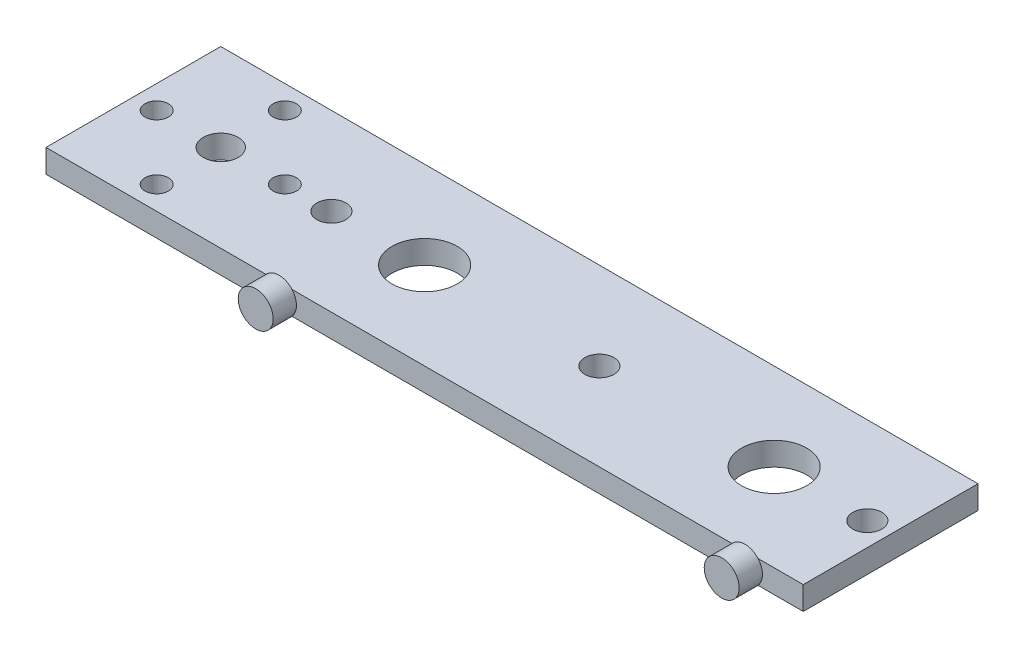
ISO-10303-21;
HEADER;
FILE_DESCRIPTION(('STEP AP214'),'2;1');
FILE_NAME('part.step','',(''),(''),'','','');
FILE_SCHEMA(('AUTOMOTIVE_DESIGN { 1 0 10303 214 1 1 1 1 }'));
ENDSEC;
DATA;
#1=APPLICATION_CONTEXT('core data for automotive mechanical design processes');
#2=APPLICATION_PROTOCOL_DEFINITION('international standard','automotive_design',2000,#1);
#3=PRODUCT_CONTEXT('',#1,'mechanical');
#4=PRODUCT('Part','Part','',(#3));
#5=PRODUCT_RELATED_PRODUCT_CATEGORY('part','',(#4));
#6=PRODUCT_DEFINITION_FORMATION('','',#4);
#7=PRODUCT_DEFINITION_CONTEXT('part definition',#1,'design');
#8=PRODUCT_DEFINITION('design','',#6,#7);
#9=PRODUCT_DEFINITION_SHAPE('','',#8);
#10=(LENGTH_UNIT() NAMED_UNIT(*) SI_UNIT(.MILLI.,.METRE.));
#11=(NAMED_UNIT(*) PLANE_ANGLE_UNIT() SI_UNIT($,.RADIAN.));
#12=(NAMED_UNIT(*) SI_UNIT($,.STERADIAN.) SOLID_ANGLE_UNIT());
#13=UNCERTAINTY_MEASURE_WITH_UNIT(LENGTH_MEASURE(1.E-05),#10,'distance_accuracy_value','');
#14=(GEOMETRIC_REPRESENTATION_CONTEXT(3) GLOBAL_UNCERTAINTY_ASSIGNED_CONTEXT((#13)) GLOBAL_UNIT_ASSIGNED_CONTEXT((#10,
#11,#12)) REPRESENTATION_CONTEXT('',''));
#15=CARTESIAN_POINT('',(0.,0.,0.));
#16=DIRECTION('',(0.,0.,1.));
#17=DIRECTION('',(1.,0.,0.));
#18=AXIS2_PLACEMENT_3D('',#15,#16,#17);
#19=CARTESIAN_POINT('',(0.,2.,7.5));
#20=DIRECTION('',(0.,0.,1.));
#21=DIRECTION('',(1.,0.,0.));
#22=AXIS2_PLACEMENT_3D('',#19,#20,#21);
#23=PLANE('',#22);
#24=CARTESIAN_POINT('',(20.,0.999999999999999,7.5));
#25=DIRECTION('',(0.,0.,1.));
#26=DIRECTION('',(1.,0.,0.));
#27=AXIS2_PLACEMENT_3D('',#24,#25,#26);
#28=CIRCLE('',#27,1.5);
#29=CARTESIAN_POINT('',(18.8819660112501,2.,7.5));
#30=VERTEX_POINT('',#29);
#31=CARTESIAN_POINT('',(18.8819660112501,0.,7.5));
#32=VERTEX_POINT('',#31);
#33=EDGE_CURVE('E12',#30,#32,#28,.T.);
#34=ORIENTED_EDGE('',*,*,#33,.F.);
#35=DIRECTION('',(-1.,0.,0.));
#36=VECTOR('',#35,1.);
#37=CARTESIAN_POINT('',(0.,2.,7.5));
#38=LINE('',#37,#36);
#39=CARTESIAN_POINT('',(-18.8819660112501,2.,7.5));
#40=VERTEX_POINT('',#39);
#41=EDGE_CURVE('E183',#30,#40,#38,.T.);
#42=ORIENTED_EDGE('',*,*,#41,.T.);
#43=CARTESIAN_POINT('',(-20.,0.999999999999995,7.5));
#44=DIRECTION('',(0.,0.,1.));
#45=DIRECTION('',(1.,0.,0.));
#46=AXIS2_PLACEMENT_3D('',#43,#44,#45);
#47=CIRCLE('',#46,1.5);
#48=CARTESIAN_POINT('',(-18.8819660112501,0.,7.5));
#49=VERTEX_POINT('',#48);
#50=EDGE_CURVE('E186',#49,#40,#47,.T.);
#51=ORIENTED_EDGE('',*,*,#50,.F.);
#52=DIRECTION('',(-1.,0.,0.));
#53=VECTOR('',#52,1.);
#54=CARTESIAN_POINT('',(0.,0.,7.5));
#55=LINE('',#54,#53);
#56=EDGE_CURVE('E597',#32,#49,#55,.T.);
#57=ORIENTED_EDGE('',*,*,#56,.F.);
#58=EDGE_LOOP('',(#34,#42,#51,#57));
#59=FACE_BOUND('',#58,.T.);
#60=ADVANCED_FACE('F119',(#59),#23,.T.);
#61=CARTESIAN_POINT('',(-21.1180339887499,2.,7.5));
#62=VERTEX_POINT('',#61);
#63=CARTESIAN_POINT('',(-21.1180339887499,0.,7.5));
#64=VERTEX_POINT('',#63);
#65=EDGE_CURVE('E138',#62,#64,#47,.T.);
#66=ORIENTED_EDGE('',*,*,#65,.F.);
#67=CARTESIAN_POINT('',(-40.,2.,7.5));
#68=VERTEX_POINT('',#67);
#69=EDGE_CURVE('E199',#62,#68,#38,.T.);
#70=ORIENTED_EDGE('',*,*,#69,.T.);
#71=DIRECTION('',(0.,-1.,0.));
#72=VECTOR('',#71,1.);
#73=CARTESIAN_POINT('',(-40.,2.,7.5));
#74=LINE('',#73,#72);
#75=CARTESIAN_POINT('',(-40.,0.,7.5));
#76=VERTEX_POINT('',#75);
#77=EDGE_CURVE('E211',#68,#76,#74,.T.);
#78=ORIENTED_EDGE('',*,*,#77,.T.);
#79=EDGE_CURVE('E322',#64,#76,#55,.T.);
#80=ORIENTED_EDGE('',*,*,#79,.F.);
#81=EDGE_LOOP('',(#66,#70,#78,#80));
#82=FACE_BOUND('',#81,.T.);
#83=ADVANCED_FACE('F394',(#82),#23,.T.);
#84=CARTESIAN_POINT('',(0.,0.,0.));
#85=DIRECTION('',(0.,1.,0.));
#86=DIRECTION('',(0.,0.,1.));
#87=AXIS2_PLACEMENT_3D('',#84,#85,#86);
#88=PLANE('',#87);
#89=CARTESIAN_POINT('',(-32.5,0.,-5.5));
#90=DIRECTION('',(0.,1.,0.));
#91=DIRECTION('',(0.,0.,1.));
#92=AXIS2_PLACEMENT_3D('',#89,#90,#91);
#93=CIRCLE('',#92,0.999999999999991);
#94=CARTESIAN_POINT('',(-32.5,0.,-4.50000000000001));
#95=VERTEX_POINT('',#94);
#96=EDGE_CURVE('E273',#95,#95,#93,.T.);
#97=ORIENTED_EDGE('',*,*,#96,.T.);
#98=EDGE_LOOP('',(#97));
#99=FACE_BOUND('',#98,.T.);
#100=CARTESIAN_POINT('',(-38.,0.,0.));
#101=DIRECTION('',(0.,1.,0.));
#102=DIRECTION('',(0.,0.,1.));
#103=AXIS2_PLACEMENT_3D('',#100,#101,#102);
#104=CIRCLE('',#103,0.999999999999991);
#105=CARTESIAN_POINT('',(-38.,0.,0.999999999999992));
#106=VERTEX_POINT('',#105);
#107=EDGE_CURVE('E239',#106,#106,#104,.T.);
#108=ORIENTED_EDGE('',*,*,#107,.T.);
#109=EDGE_LOOP('',(#108));
#110=FACE_BOUND('',#109,.T.);
#111=CARTESIAN_POINT('',(-32.5,0.,0.));
#112=DIRECTION('',(0.,1.,0.));
#113=DIRECTION('',(0.,0.,1.));
#114=AXIS2_PLACEMENT_3D('',#111,#112,#113);
#115=CIRCLE('',#114,1.5);
#116=CARTESIAN_POINT('',(-32.5,0.,1.50000000000001));
#117=VERTEX_POINT('',#116);
#118=EDGE_CURVE('E281',#117,#117,#115,.T.);
#119=ORIENTED_EDGE('',*,*,#118,.T.);
#120=EDGE_LOOP('',(#119));
#121=FACE_BOUND('',#120,.T.);
#122=CARTESIAN_POINT('',(-32.5,0.,5.5));
#123=DIRECTION('',(0.,1.,0.));
#124=DIRECTION('',(0.,0.,1.));
#125=AXIS2_PLACEMENT_3D('',#122,#123,#124);
#126=CIRCLE('',#125,0.999999999999998);
#127=CARTESIAN_POINT('',(-32.5,0.,6.5));
#128=VERTEX_POINT('',#127);
#129=EDGE_CURVE('E263',#128,#128,#126,.T.);
#130=ORIENTED_EDGE('',*,*,#129,.T.);
#131=EDGE_LOOP('',(#130));
#132=FACE_BOUND('',#131,.T.);
#133=CARTESIAN_POINT('',(-27.,0.,0.));
#134=DIRECTION('',(0.,1.,0.));
#135=DIRECTION('',(0.,0.,1.));
#136=AXIS2_PLACEMENT_3D('',#133,#134,#135);
#137=CIRCLE('',#136,0.999999999999998);
#138=CARTESIAN_POINT('',(-27.,0.,0.999999999999999));
#139=VERTEX_POINT('',#138);
#140=EDGE_CURVE('E264',#139,#139,#137,.T.);
#141=ORIENTED_EDGE('',*,*,#140,.T.);
#142=EDGE_LOOP('',(#141));
#143=FACE_BOUND('',#142,.T.);
#144=CARTESIAN_POINT('',(-15.,0.,0.));
#145=DIRECTION('',(0.,-1.,0.));
#146=DIRECTION('',(0.,0.,-1.));
#147=AXIS2_PLACEMENT_3D('',#144,#145,#146);
#148=CIRCLE('',#147,2.8);
#149=CARTESIAN_POINT('',(-15.,0.,-2.8));
#150=VERTEX_POINT('',#149);
#151=EDGE_CURVE('E229',#150,#150,#148,.T.);
#152=ORIENTED_EDGE('',*,*,#151,.F.);
#153=EDGE_LOOP('',(#152));
#154=FACE_BOUND('',#153,.T.);
#155=CARTESIAN_POINT('',(15.,0.,0.));
#156=DIRECTION('',(0.,1.,0.));
#157=DIRECTION('',(0.,0.,1.));
#158=AXIS2_PLACEMENT_3D('',#155,#156,#157);
#159=CIRCLE('',#158,2.80000000000001);
#160=CARTESIAN_POINT('',(15.,0.,2.80000000000001));
#161=VERTEX_POINT('',#160);
#162=EDGE_CURVE('E230',#161,#161,#159,.T.);
#163=ORIENTED_EDGE('',*,*,#162,.T.);
#164=EDGE_LOOP('',(#163));
#165=FACE_BOUND('',#164,.T.);
#166=CARTESIAN_POINT('',(0.,0.,0.));
#167=DIRECTION('',(0.,1.,0.));
#168=DIRECTION('',(0.,0.,1.));
#169=AXIS2_PLACEMENT_3D('',#166,#167,#168);
#170=CIRCLE('',#169,1.25);
#171=CARTESIAN_POINT('',(0.,0.,1.25));
#172=VERTEX_POINT('',#171);
#173=EDGE_CURVE('E252',#172,#172,#170,.T.);
#174=ORIENTED_EDGE('',*,*,#173,.T.);
#175=EDGE_LOOP('',(#174));
#176=FACE_BOUND('',#175,.T.);
#177=DIRECTION('',(0.,0.,-1.));
#178=VECTOR('',#177,1.);
#179=CARTESIAN_POINT('',(-40.,0.,0.));
#180=LINE('',#179,#178);
#181=CARTESIAN_POINT('',(-40.,0.,-7.5));
#182=VERTEX_POINT('',#181);
#183=EDGE_CURVE('E318',#76,#182,#180,.T.);
#184=ORIENTED_EDGE('',*,*,#183,.T.);
#185=DIRECTION('',(-1.,0.,0.));
#186=VECTOR('',#185,1.);
#187=CARTESIAN_POINT('',(0.,0.,-7.5));
#188=LINE('',#187,#186);
#189=CARTESIAN_POINT('',(25.,0.,-7.5));
#190=VERTEX_POINT('',#189);
#191=EDGE_CURVE('E310',#190,#182,#188,.T.);
#192=ORIENTED_EDGE('',*,*,#191,.F.);
#193=DIRECTION('',(0.,0.,1.));
#194=VECTOR('',#193,1.);
#195=CARTESIAN_POINT('',(25.,0.,-7.5));
#196=LINE('',#195,#194);
#197=CARTESIAN_POINT('',(25.,0.,7.5));
#198=VERTEX_POINT('',#197);
#199=EDGE_CURVE('E306',#190,#198,#196,.T.);
#200=ORIENTED_EDGE('',*,*,#199,.T.);
#201=CARTESIAN_POINT('',(21.1180339887499,0.,7.5));
#202=VERTEX_POINT('',#201);
#203=EDGE_CURVE('E323',#198,#202,#55,.T.);
#204=ORIENTED_EDGE('',*,*,#203,.T.);
#205=EDGE_CURVE('E327',#202,#32,#55,.T.);
#206=ORIENTED_EDGE('',*,*,#205,.T.);
#207=ORIENTED_EDGE('',*,*,#56,.T.);
#208=EDGE_CURVE('E599',#49,#64,#55,.T.);
#209=ORIENTED_EDGE('',*,*,#208,.T.);
#210=ORIENTED_EDGE('',*,*,#79,.T.);
#211=EDGE_LOOP('',(#184,#192,#200,#204,#206,#207,#209,#210));
#212=FACE_BOUND('',#211,.T.);
#213=CARTESIAN_POINT('',(23.,0.,0.));
#214=DIRECTION('',(0.,1.,0.));
#215=DIRECTION('',(0.,0.,1.));
#216=AXIS2_PLACEMENT_3D('',#213,#214,#215);
#217=CIRCLE('',#216,1.25);
#218=CARTESIAN_POINT('',(23.,0.,1.25));
#219=VERTEX_POINT('',#218);
#220=EDGE_CURVE('E248',#219,#219,#217,.T.);
#221=ORIENTED_EDGE('',*,*,#220,.T.);
#222=EDGE_LOOP('',(#221));
#223=FACE_BOUND('',#222,.T.);
#224=CARTESIAN_POINT('',(-23.,0.,0.));
#225=DIRECTION('',(0.,-1.,0.));
#226=DIRECTION('',(0.,0.,-1.));
#227=AXIS2_PLACEMENT_3D('',#224,#225,#226);
#228=CIRCLE('',#227,1.25);
#229=CARTESIAN_POINT('',(-23.,0.,-1.25));
#230=VERTEX_POINT('',#229);
#231=EDGE_CURVE('E247',#230,#230,#228,.T.);
#232=ORIENTED_EDGE('',*,*,#231,.F.);
#233=EDGE_LOOP('',(#232));
#234=FACE_BOUND('',#233,.T.);
#235=ADVANCED_FACE('F355',(#99,#110,#121,#132,#143,#154,#165,#176,#212,#223,#234),#88,.F.);
#236=CARTESIAN_POINT('',(0.,2.,0.));
#237=DIRECTION('',(0.,1.,0.));
#238=DIRECTION('',(0.,0.,1.));
#239=AXIS2_PLACEMENT_3D('',#236,#237,#238);
#240=PLANE('',#239);
#241=CARTESIAN_POINT('',(-32.5,2.,-5.5));
#242=DIRECTION('',(0.,1.,0.));
#243=DIRECTION('',(0.,0.,1.));
#244=AXIS2_PLACEMENT_3D('',#241,#242,#243);
#245=CIRCLE('',#244,0.999999999999991);
#246=CARTESIAN_POINT('',(-32.5,2.,-4.50000000000001));
#247=VERTEX_POINT('',#246);
#248=EDGE_CURVE('E291',#247,#247,#245,.T.);
#249=ORIENTED_EDGE('',*,*,#248,.F.);
#250=EDGE_LOOP('',(#249));
#251=FACE_BOUND('',#250,.T.);
#252=CARTESIAN_POINT('',(-38.,2.,0.));
#253=DIRECTION('',(0.,1.,0.));
#254=DIRECTION('',(0.,0.,1.));
#255=AXIS2_PLACEMENT_3D('',#252,#253,#254);
#256=CIRCLE('',#255,0.999999999999991);
#257=CARTESIAN_POINT('',(-38.,2.,0.999999999999992));
#258=VERTEX_POINT('',#257);
#259=EDGE_CURVE('E277',#258,#258,#256,.T.);
#260=ORIENTED_EDGE('',*,*,#259,.F.);
#261=EDGE_LOOP('',(#260));
#262=FACE_BOUND('',#261,.T.);
#263=CARTESIAN_POINT('',(-32.5,2.,0.));
#264=DIRECTION('',(0.,1.,0.));
#265=DIRECTION('',(0.,0.,1.));
#266=AXIS2_PLACEMENT_3D('',#263,#264,#265);
#267=CIRCLE('',#266,1.5);
#268=CARTESIAN_POINT('',(-32.5,2.,1.50000000000001));
#269=VERTEX_POINT('',#268);
#270=EDGE_CURVE('E268',#269,#269,#267,.T.);
#271=ORIENTED_EDGE('',*,*,#270,.F.);
#272=EDGE_LOOP('',(#271));
#273=FACE_BOUND('',#272,.T.);
#274=CARTESIAN_POINT('',(-32.5,2.,5.5));
#275=DIRECTION('',(0.,1.,0.));
#276=DIRECTION('',(0.,0.,1.));
#277=AXIS2_PLACEMENT_3D('',#274,#275,#276);
#278=CIRCLE('',#277,0.999999999999998);
#279=CARTESIAN_POINT('',(-32.5,2.,6.5));
#280=VERTEX_POINT('',#279);
#281=EDGE_CURVE('E259',#280,#280,#278,.T.);
#282=ORIENTED_EDGE('',*,*,#281,.F.);
#283=EDGE_LOOP('',(#282));
#284=FACE_BOUND('',#283,.T.);
#285=CARTESIAN_POINT('',(-27.,2.,0.));
#286=DIRECTION('',(0.,1.,0.));
#287=DIRECTION('',(0.,0.,1.));
#288=AXIS2_PLACEMENT_3D('',#285,#286,#287);
#289=CIRCLE('',#288,0.999999999999998);
#290=CARTESIAN_POINT('',(-27.,2.,0.999999999999999));
#291=VERTEX_POINT('',#290);
#292=EDGE_CURVE('E269',#291,#291,#289,.T.);
#293=ORIENTED_EDGE('',*,*,#292,.F.);
#294=EDGE_LOOP('',(#293));
#295=FACE_BOUND('',#294,.T.);
#296=CARTESIAN_POINT('',(23.,2.,0.));
#297=DIRECTION('',(0.,1.,0.));
#298=DIRECTION('',(0.,0.,1.));
#299=AXIS2_PLACEMENT_3D('',#296,#297,#298);
#300=CIRCLE('',#299,1.25);
#301=CARTESIAN_POINT('',(23.,2.,1.25));
#302=VERTEX_POINT('',#301);
#303=EDGE_CURVE('E234',#302,#302,#300,.T.);
#304=ORIENTED_EDGE('',*,*,#303,.F.);
#305=EDGE_LOOP('',(#304));
#306=FACE_BOUND('',#305,.T.);
#307=CARTESIAN_POINT('',(15.,2.,0.));
#308=DIRECTION('',(0.,1.,0.));
#309=DIRECTION('',(0.,0.,1.));
#310=AXIS2_PLACEMENT_3D('',#307,#308,#309);
#311=CIRCLE('',#310,2.80000000000001);
#312=CARTESIAN_POINT('',(15.,2.,2.80000000000001));
#313=VERTEX_POINT('',#312);
#314=EDGE_CURVE('E235',#313,#313,#311,.T.);
#315=ORIENTED_EDGE('',*,*,#314,.F.);
#316=EDGE_LOOP('',(#315));
#317=FACE_BOUND('',#316,.T.);
#318=CARTESIAN_POINT('',(0.,2.,0.));
#319=DIRECTION('',(0.,1.,0.));
#320=DIRECTION('',(0.,0.,1.));
#321=AXIS2_PLACEMENT_3D('',#318,#319,#320);
#322=CIRCLE('',#321,1.25);
#323=CARTESIAN_POINT('',(0.,2.,1.25));
#324=VERTEX_POINT('',#323);
#325=EDGE_CURVE('E302',#324,#324,#322,.T.);
#326=ORIENTED_EDGE('',*,*,#325,.F.);
#327=EDGE_LOOP('',(#326));
#328=FACE_BOUND('',#327,.T.);
#329=DIRECTION('',(0.,0.,-1.));
#330=VECTOR('',#329,1.);
#331=CARTESIAN_POINT('',(-40.,2.,0.));
#332=LINE('',#331,#330);
#333=CARTESIAN_POINT('',(-40.,2.,-7.5));
#334=VERTEX_POINT('',#333);
#335=EDGE_CURVE('E307',#68,#334,#332,.T.);
#336=ORIENTED_EDGE('',*,*,#335,.F.);
#337=ORIENTED_EDGE('',*,*,#69,.F.);
#338=EDGE_CURVE('E193',#40,#62,#38,.T.);
#339=ORIENTED_EDGE('',*,*,#338,.F.);
#340=ORIENTED_EDGE('',*,*,#41,.F.);
#341=CARTESIAN_POINT('',(21.1180339887499,2.,7.5));
#342=VERTEX_POINT('',#341);
#343=EDGE_CURVE('E192',#342,#30,#38,.T.);
#344=ORIENTED_EDGE('',*,*,#343,.F.);
#345=CARTESIAN_POINT('',(25.,2.,7.5));
#346=VERTEX_POINT('',#345);
#347=EDGE_CURVE('E311',#346,#342,#38,.T.);
#348=ORIENTED_EDGE('',*,*,#347,.F.);
#349=DIRECTION('',(0.,0.,1.));
#350=VECTOR('',#349,1.);
#351=CARTESIAN_POINT('',(25.,2.,-7.5));
#352=LINE('',#351,#350);
#353=CARTESIAN_POINT('',(25.,2.,-7.5));
#354=VERTEX_POINT('',#353);
#355=EDGE_CURVE('E336',#354,#346,#352,.T.);
#356=ORIENTED_EDGE('',*,*,#355,.F.);
#357=DIRECTION('',(-1.,0.,0.));
#358=VECTOR('',#357,1.);
#359=CARTESIAN_POINT('',(0.,2.,-7.5));
#360=LINE('',#359,#358);
#361=EDGE_CURVE('E314',#354,#334,#360,.T.);
#362=ORIENTED_EDGE('',*,*,#361,.T.);
#363=EDGE_LOOP('',(#336,#337,#339,#340,#344,#348,#356,#362));
#364=FACE_BOUND('',#363,.T.);
#365=CARTESIAN_POINT('',(-15.,2.,0.));
#366=DIRECTION('',(0.,1.,0.));
#367=DIRECTION('',(0.,0.,1.));
#368=AXIS2_PLACEMENT_3D('',#365,#366,#367);
#369=CIRCLE('',#368,2.8);
#370=CARTESIAN_POINT('',(-15.,2.,2.8));
#371=VERTEX_POINT('',#370);
#372=EDGE_CURVE('E225',#371,#371,#369,.F.);
#373=ORIENTED_EDGE('',*,*,#372,.T.);
#374=EDGE_LOOP('',(#373));
#375=FACE_BOUND('',#374,.T.);
#376=CARTESIAN_POINT('',(-23.,2.,0.));
#377=DIRECTION('',(0.,1.,0.));
#378=DIRECTION('',(0.,0.,1.));
#379=AXIS2_PLACEMENT_3D('',#376,#377,#378);
#380=CIRCLE('',#379,1.25);
#381=CARTESIAN_POINT('',(-23.,2.,1.25000000000001));
#382=VERTEX_POINT('',#381);
#383=EDGE_CURVE('E243',#382,#382,#380,.F.);
#384=ORIENTED_EDGE('',*,*,#383,.T.);
#385=EDGE_LOOP('',(#384));
#386=FACE_BOUND('',#385,.T.);
#387=ADVANCED_FACE('F197',(#251,#262,#273,#284,#295,#306,#317,#328,#364,#375,#386),#240,.T.);
#388=CARTESIAN_POINT('',(0.,2.,-7.5));
#389=DIRECTION('',(0.,0.,1.));
#390=DIRECTION('',(1.,0.,0.));
#391=AXIS2_PLACEMENT_3D('',#388,#389,#390);
#392=PLANE('',#391);
#393=ORIENTED_EDGE('',*,*,#191,.T.);
#394=DIRECTION('',(0.,-1.,0.));
#395=VECTOR('',#394,1.);
#396=CARTESIAN_POINT('',(-40.,2.,-7.5));
#397=LINE('',#396,#395);
#398=EDGE_CURVE('E317',#334,#182,#397,.T.);
#399=ORIENTED_EDGE('',*,*,#398,.F.);
#400=ORIENTED_EDGE('',*,*,#361,.F.);
#401=DIRECTION('',(0.,-1.,0.));
#402=VECTOR('',#401,1.);
#403=CARTESIAN_POINT('',(25.,2.,-7.5));
#404=LINE('',#403,#402);
#405=EDGE_CURVE('E340',#354,#190,#404,.T.);
#406=ORIENTED_EDGE('',*,*,#405,.T.);
#407=EDGE_LOOP('',(#393,#399,#400,#406));
#408=FACE_BOUND('',#407,.T.);
#409=ADVANCED_FACE('F361',(#408),#392,.F.);
#410=EDGE_CURVE('E129',#202,#342,#28,.T.);
#411=ORIENTED_EDGE('',*,*,#410,.F.);
#412=ORIENTED_EDGE('',*,*,#203,.F.);
#413=DIRECTION('',(0.,-1.,0.));
#414=VECTOR('',#413,1.);
#415=CARTESIAN_POINT('',(25.,2.,7.5));
#416=LINE('',#415,#414);
#417=EDGE_CURVE('E123',#346,#198,#416,.T.);
#418=ORIENTED_EDGE('',*,*,#417,.F.);
#419=ORIENTED_EDGE('',*,*,#347,.T.);
#420=EDGE_LOOP('',(#411,#412,#418,#419));
#421=FACE_BOUND('',#420,.T.);
#422=ADVANCED_FACE('F366',(#421),#23,.T.);
#423=CARTESIAN_POINT('',(-40.,2.,0.));
#424=DIRECTION('',(-1.,0.,0.));
#425=DIRECTION('',(0.,0.,1.));
#426=AXIS2_PLACEMENT_3D('',#423,#424,#425);
#427=PLANE('',#426);
#428=ORIENTED_EDGE('',*,*,#183,.F.);
#429=ORIENTED_EDGE('',*,*,#77,.F.);
#430=ORIENTED_EDGE('',*,*,#335,.T.);
#431=ORIENTED_EDGE('',*,*,#398,.T.);
#432=EDGE_LOOP('',(#428,#429,#430,#431));
#433=FACE_BOUND('',#432,.T.);
#434=ADVANCED_FACE('F364',(#433),#427,.T.);
#435=CARTESIAN_POINT('',(25.,2.,-7.5));
#436=DIRECTION('',(1.,0.,0.));
#437=DIRECTION('',(0.,0.,-1.));
#438=AXIS2_PLACEMENT_3D('',#435,#436,#437);
#439=PLANE('',#438);
#440=ORIENTED_EDGE('',*,*,#199,.F.);
#441=ORIENTED_EDGE('',*,*,#405,.F.);
#442=ORIENTED_EDGE('',*,*,#355,.T.);
#443=ORIENTED_EDGE('',*,*,#417,.T.);
#444=EDGE_LOOP('',(#440,#441,#442,#443));
#445=FACE_BOUND('',#444,.T.);
#446=ADVANCED_FACE('F121',(#445),#439,.T.);
#447=CARTESIAN_POINT('',(0.,9.91959594928935,0.));
#448=DIRECTION('',(0.,-1.,0.));
#449=DIRECTION('',(0.,0.,-1.));
#450=AXIS2_PLACEMENT_3D('',#447,#448,#449);
#451=CYLINDRICAL_SURFACE('',#450,1.25);
#452=ORIENTED_EDGE('',*,*,#173,.F.);
#453=EDGE_LOOP('',(#452));
#454=FACE_BOUND('',#453,.T.);
#455=ORIENTED_EDGE('',*,*,#325,.T.);
#456=EDGE_LOOP('',(#455));
#457=FACE_BOUND('',#456,.T.);
#458=ADVANCED_FACE('F407',(#454,#457),#451,.F.);
#459=CARTESIAN_POINT('',(15.,9.91959594928935,0.));
#460=DIRECTION('',(0.,-1.,0.));
#461=DIRECTION('',(0.,0.,-1.));
#462=AXIS2_PLACEMENT_3D('',#459,#460,#461);
#463=CYLINDRICAL_SURFACE('',#462,2.80000000000001);
#464=ORIENTED_EDGE('',*,*,#162,.F.);
#465=EDGE_LOOP('',(#464));
#466=FACE_BOUND('',#465,.T.);
#467=ORIENTED_EDGE('',*,*,#314,.T.);
#468=EDGE_LOOP('',(#467));
#469=FACE_BOUND('',#468,.T.);
#470=ADVANCED_FACE('F413',(#466,#469),#463,.F.);
#471=CARTESIAN_POINT('',(-15.,9.91959594928935,0.));
#472=DIRECTION('',(0.,-1.,0.));
#473=DIRECTION('',(0.,0.,-1.));
#474=AXIS2_PLACEMENT_3D('',#471,#472,#473);
#475=CYLINDRICAL_SURFACE('',#474,2.8);
#476=ORIENTED_EDGE('',*,*,#151,.T.);
#477=EDGE_LOOP('',(#476));
#478=FACE_BOUND('',#477,.T.);
#479=ORIENTED_EDGE('',*,*,#372,.F.);
#480=EDGE_LOOP('',(#479));
#481=FACE_BOUND('',#480,.T.);
#482=ADVANCED_FACE('F419',(#478,#481),#475,.F.);
#483=CARTESIAN_POINT('',(23.,9.91959594928935,0.));
#484=DIRECTION('',(0.,-1.,0.));
#485=DIRECTION('',(0.,0.,-1.));
#486=AXIS2_PLACEMENT_3D('',#483,#484,#485);
#487=CYLINDRICAL_SURFACE('',#486,1.25);
#488=ORIENTED_EDGE('',*,*,#220,.F.);
#489=EDGE_LOOP('',(#488));
#490=FACE_BOUND('',#489,.T.);
#491=ORIENTED_EDGE('',*,*,#303,.T.);
#492=EDGE_LOOP('',(#491));
#493=FACE_BOUND('',#492,.T.);
#494=ADVANCED_FACE('F456',(#490,#493),#487,.F.);
#495=CARTESIAN_POINT('',(-23.,9.91959594928935,0.));
#496=DIRECTION('',(0.,-1.,0.));
#497=DIRECTION('',(0.,0.,-1.));
#498=AXIS2_PLACEMENT_3D('',#495,#496,#497);
#499=CYLINDRICAL_SURFACE('',#498,1.25);
#500=ORIENTED_EDGE('',*,*,#231,.T.);
#501=EDGE_LOOP('',(#500));
#502=FACE_BOUND('',#501,.T.);
#503=ORIENTED_EDGE('',*,*,#383,.F.);
#504=EDGE_LOOP('',(#503));
#505=FACE_BOUND('',#504,.T.);
#506=ADVANCED_FACE('F462',(#502,#505),#499,.F.);
#507=CARTESIAN_POINT('',(-27.,9.91959594928935,0.));
#508=DIRECTION('',(0.,-1.,0.));
#509=DIRECTION('',(0.,0.,-1.));
#510=AXIS2_PLACEMENT_3D('',#507,#508,#509);
#511=CYLINDRICAL_SURFACE('',#510,0.999999999999998);
#512=ORIENTED_EDGE('',*,*,#140,.F.);
#513=EDGE_LOOP('',(#512));
#514=FACE_BOUND('',#513,.T.);
#515=ORIENTED_EDGE('',*,*,#292,.T.);
#516=EDGE_LOOP('',(#515));
#517=FACE_BOUND('',#516,.T.);
#518=ADVANCED_FACE('F464',(#514,#517),#511,.F.);
#519=CARTESIAN_POINT('',(-32.5,9.91959594928935,5.5));
#520=DIRECTION('',(0.,-1.,0.));
#521=DIRECTION('',(0.,0.,-1.));
#522=AXIS2_PLACEMENT_3D('',#519,#520,#521);
#523=CYLINDRICAL_SURFACE('',#522,0.999999999999998);
#524=ORIENTED_EDGE('',*,*,#129,.F.);
#525=EDGE_LOOP('',(#524));
#526=FACE_BOUND('',#525,.T.);
#527=ORIENTED_EDGE('',*,*,#281,.T.);
#528=EDGE_LOOP('',(#527));
#529=FACE_BOUND('',#528,.T.);
#530=ADVANCED_FACE('F471',(#526,#529),#523,.F.);
#531=CARTESIAN_POINT('',(-32.5,9.91959594928935,0.));
#532=DIRECTION('',(0.,-1.,0.));
#533=DIRECTION('',(0.,0.,-1.));
#534=AXIS2_PLACEMENT_3D('',#531,#532,#533);
#535=CYLINDRICAL_SURFACE('',#534,1.5);
#536=ORIENTED_EDGE('',*,*,#118,.F.);
#537=EDGE_LOOP('',(#536));
#538=FACE_BOUND('',#537,.T.);
#539=ORIENTED_EDGE('',*,*,#270,.T.);
#540=EDGE_LOOP('',(#539));
#541=FACE_BOUND('',#540,.T.);
#542=ADVANCED_FACE('F478',(#538,#541),#535,.F.);
#543=CARTESIAN_POINT('',(-38.,9.91959594928935,0.));
#544=DIRECTION('',(0.,-1.,0.));
#545=DIRECTION('',(0.,0.,-1.));
#546=AXIS2_PLACEMENT_3D('',#543,#544,#545);
#547=CYLINDRICAL_SURFACE('',#546,0.999999999999991);
#548=ORIENTED_EDGE('',*,*,#107,.F.);
#549=EDGE_LOOP('',(#548));
#550=FACE_BOUND('',#549,.T.);
#551=ORIENTED_EDGE('',*,*,#259,.T.);
#552=EDGE_LOOP('',(#551));
#553=FACE_BOUND('',#552,.T.);
#554=ADVANCED_FACE('F481',(#550,#553),#547,.F.);
#555=CARTESIAN_POINT('',(-32.5,9.91959594928935,-5.5));
#556=DIRECTION('',(0.,-1.,0.));
#557=DIRECTION('',(0.,0.,-1.));
#558=AXIS2_PLACEMENT_3D('',#555,#556,#557);
#559=CYLINDRICAL_SURFACE('',#558,0.999999999999991);
#560=ORIENTED_EDGE('',*,*,#96,.F.);
#561=EDGE_LOOP('',(#560));
#562=FACE_BOUND('',#561,.T.);
#563=ORIENTED_EDGE('',*,*,#248,.T.);
#564=EDGE_LOOP('',(#563));
#565=FACE_BOUND('',#564,.T.);
#566=ADVANCED_FACE('F426',(#562,#565),#559,.F.);
#567=CARTESIAN_POINT('',(-20.,0.999999999999995,7.5));
#568=DIRECTION('',(0.,0.,1.));
#569=DIRECTION('',(1.,0.,0.));
#570=AXIS2_PLACEMENT_3D('',#567,#568,#569);
#571=PLANE('',#570);
#572=EDGE_CURVE('E207',#40,#62,#47,.T.);
#573=ORIENTED_EDGE('',*,*,#572,.F.);
#574=ORIENTED_EDGE('',*,*,#338,.T.);
#575=EDGE_LOOP('',(#573,#574));
#576=FACE_BOUND('',#575,.T.);
#577=ADVANCED_FACE('F213',(#576),#571,.F.);
#578=CARTESIAN_POINT('',(-20.,0.999999999999995,9.5));
#579=DIRECTION('',(0.,0.,-1.));
#580=DIRECTION('',(-1.,0.,0.));
#581=AXIS2_PLACEMENT_3D('',#578,#579,#580);
#582=CYLINDRICAL_SURFACE('',#581,1.5);
#583=CARTESIAN_POINT('',(-20.,0.999999999999995,9.5));
#584=DIRECTION('',(0.,0.,1.));
#585=DIRECTION('',(1.,0.,0.));
#586=AXIS2_PLACEMENT_3D('',#583,#584,#585);
#587=CIRCLE('',#586,1.5);
#588=CARTESIAN_POINT('',(-18.5,0.999999999999995,9.5));
#589=VERTEX_POINT('',#588);
#590=EDGE_CURVE('E219',#589,#589,#587,.T.);
#591=ORIENTED_EDGE('',*,*,#590,.F.);
#592=EDGE_LOOP('',(#591));
#593=FACE_BOUND('',#592,.T.);
#594=ORIENTED_EDGE('',*,*,#572,.T.);
#595=ORIENTED_EDGE('',*,*,#65,.T.);
#596=EDGE_CURVE('E209',#64,#49,#47,.T.);
#597=ORIENTED_EDGE('',*,*,#596,.T.);
#598=ORIENTED_EDGE('',*,*,#50,.T.);
#599=EDGE_LOOP('',(#594,#595,#597,#598));
#600=FACE_BOUND('',#599,.T.);
#601=ADVANCED_FACE('F206',(#593,#600),#582,.T.);
#602=CARTESIAN_POINT('',(-20.,0.999999999999995,9.5));
#603=DIRECTION('',(0.,0.,1.));
#604=DIRECTION('',(1.,0.,0.));
#605=AXIS2_PLACEMENT_3D('',#602,#603,#604);
#606=PLANE('',#605);
#607=ORIENTED_EDGE('',*,*,#590,.T.);
#608=EDGE_LOOP('',(#607));
#609=FACE_BOUND('',#608,.T.);
#610=ADVANCED_FACE('F551',(#609),#606,.T.);
#611=ORIENTED_EDGE('',*,*,#208,.F.);
#612=ORIENTED_EDGE('',*,*,#596,.F.);
#613=EDGE_LOOP('',(#611,#612));
#614=FACE_BOUND('',#613,.T.);
#615=ADVANCED_FACE('F389',(#614),#571,.F.);
#616=CARTESIAN_POINT('',(20.,0.999999999999999,7.5));
#617=DIRECTION('',(0.,0.,1.));
#618=DIRECTION('',(1.,0.,0.));
#619=AXIS2_PLACEMENT_3D('',#616,#617,#618);
#620=PLANE('',#619);
#621=EDGE_CURVE('E218',#342,#30,#28,.T.);
#622=ORIENTED_EDGE('',*,*,#621,.F.);
#623=ORIENTED_EDGE('',*,*,#343,.T.);
#624=EDGE_LOOP('',(#622,#623));
#625=FACE_BOUND('',#624,.T.);
#626=ADVANCED_FACE('F381',(#625),#620,.F.);
#627=CARTESIAN_POINT('',(20.,0.999999999999999,9.5));
#628=DIRECTION('',(0.,0.,-1.));
#629=DIRECTION('',(-1.,0.,0.));
#630=AXIS2_PLACEMENT_3D('',#627,#628,#629);
#631=CYLINDRICAL_SURFACE('',#630,1.5);
#632=CARTESIAN_POINT('',(20.,0.999999999999999,9.5));
#633=DIRECTION('',(0.,0.,1.));
#634=DIRECTION('',(1.,0.,0.));
#635=AXIS2_PLACEMENT_3D('',#632,#633,#634);
#636=CIRCLE('',#635,1.5);
#637=CARTESIAN_POINT('',(21.5,0.999999999999999,9.5));
#638=VERTEX_POINT('',#637);
#639=EDGE_CURVE('E295',#638,#638,#636,.T.);
#640=ORIENTED_EDGE('',*,*,#639,.F.);
#641=EDGE_LOOP('',(#640));
#642=FACE_BOUND('',#641,.T.);
#643=ORIENTED_EDGE('',*,*,#621,.T.);
#644=ORIENTED_EDGE('',*,*,#33,.T.);
#645=EDGE_CURVE('E131',#32,#202,#28,.T.);
#646=ORIENTED_EDGE('',*,*,#645,.T.);
#647=ORIENTED_EDGE('',*,*,#410,.T.);
#648=EDGE_LOOP('',(#643,#644,#646,#647));
#649=FACE_BOUND('',#648,.T.);
#650=ADVANCED_FACE('F379',(#642,#649),#631,.T.);
#651=CARTESIAN_POINT('',(20.,0.999999999999999,9.5));
#652=DIRECTION('',(0.,0.,1.));
#653=DIRECTION('',(1.,0.,0.));
#654=AXIS2_PLACEMENT_3D('',#651,#652,#653);
#655=PLANE('',#654);
#656=ORIENTED_EDGE('',*,*,#639,.T.);
#657=EDGE_LOOP('',(#656));
#658=FACE_BOUND('',#657,.T.);
#659=ADVANCED_FACE('F377',(#658),#655,.T.);
#660=ORIENTED_EDGE('',*,*,#205,.F.);
#661=ORIENTED_EDGE('',*,*,#645,.F.);
#662=EDGE_LOOP('',(#660,#661));
#663=FACE_BOUND('',#662,.T.);
#664=ADVANCED_FACE('F387',(#663),#620,.F.);
#665=CLOSED_SHELL('',(#60,#83,#235,#387,#409,#422,#434,#446,#458,#470,#482,#494,#506,#518,#530,
#542,#554,#566,#577,#601,#610,#615,#626,#650,#659,#664));
#666=MANIFOLD_SOLID_BREP('B2',#665);
#667=ADVANCED_BREP_SHAPE_REPRESENTATION('',(#18,#666),#14);
#668=SHAPE_DEFINITION_REPRESENTATION(#9,#667);
ENDSEC;
END-ISO-10303-21;
